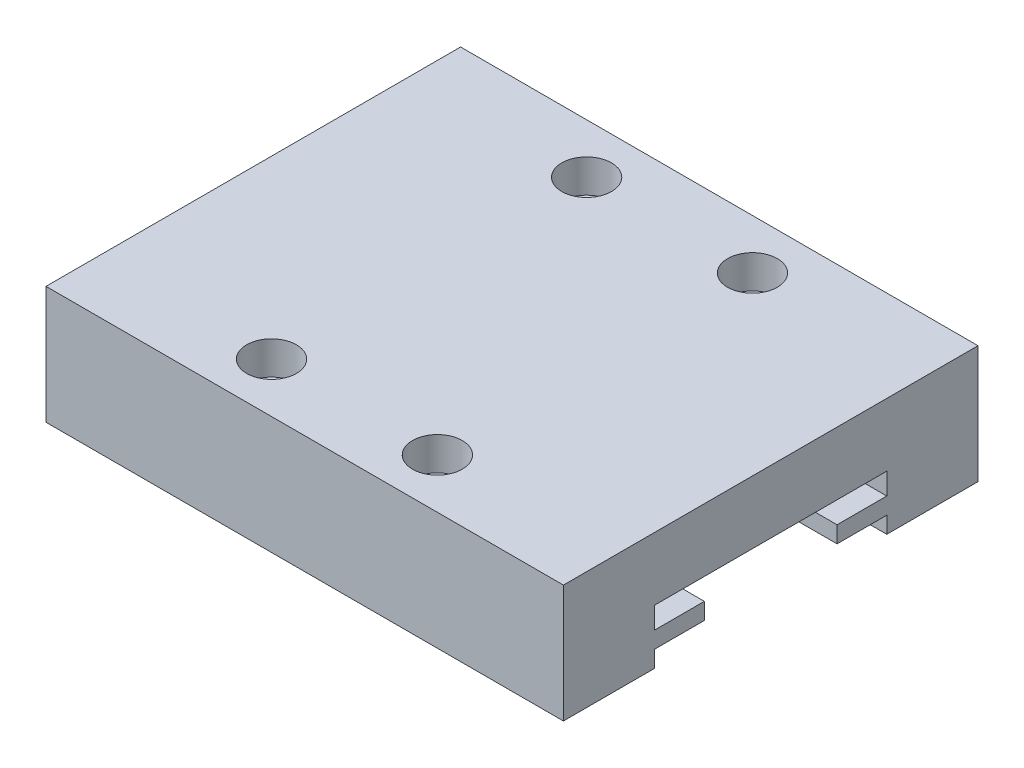
ISO-10303-21;
HEADER;
FILE_DESCRIPTION(('STEP AP214'),'2;1');
FILE_NAME('part.step','',(''),(''),'','','');
FILE_SCHEMA(('AUTOMOTIVE_DESIGN { 1 0 10303 214 1 1 1 1 }'));
ENDSEC;
DATA;
#1=APPLICATION_CONTEXT('core data for automotive mechanical design processes');
#2=APPLICATION_PROTOCOL_DEFINITION('international standard','automotive_design',2000,#1);
#3=PRODUCT_CONTEXT('',#1,'mechanical');
#4=PRODUCT('Part','Part','',(#3));
#5=PRODUCT_RELATED_PRODUCT_CATEGORY('part','',(#4));
#6=PRODUCT_DEFINITION_FORMATION('','',#4);
#7=PRODUCT_DEFINITION_CONTEXT('part definition',#1,'design');
#8=PRODUCT_DEFINITION('design','',#6,#7);
#9=PRODUCT_DEFINITION_SHAPE('','',#8);
#10=(LENGTH_UNIT() NAMED_UNIT(*) SI_UNIT(.MILLI.,.METRE.));
#11=(NAMED_UNIT(*) PLANE_ANGLE_UNIT() SI_UNIT($,.RADIAN.));
#12=(NAMED_UNIT(*) SI_UNIT($,.STERADIAN.) SOLID_ANGLE_UNIT());
#13=UNCERTAINTY_MEASURE_WITH_UNIT(LENGTH_MEASURE(1.E-05),#10,'distance_accuracy_value','');
#14=(GEOMETRIC_REPRESENTATION_CONTEXT(3) GLOBAL_UNCERTAINTY_ASSIGNED_CONTEXT((#13)) GLOBAL_UNIT_ASSIGNED_CONTEXT((#10,
#11,#12)) REPRESENTATION_CONTEXT('',''));
#15=CARTESIAN_POINT('',(0.,0.,0.));
#16=DIRECTION('',(0.,0.,1.));
#17=DIRECTION('',(1.,0.,0.));
#18=AXIS2_PLACEMENT_3D('',#15,#16,#17);
#19=CARTESIAN_POINT('',(0.,0.,0.));
#20=DIRECTION('',(0.,-1.,0.));
#21=DIRECTION('',(0.,0.,-1.));
#22=AXIS2_PLACEMENT_3D('',#19,#20,#21);
#23=PLANE('',#22);
#24=DIRECTION('',(1.,0.,0.));
#25=VECTOR('',#24,1.);
#26=CARTESIAN_POINT('',(0.,0.,-19.5));
#27=LINE('',#26,#25);
#28=CARTESIAN_POINT('',(0.,0.,-19.5));
#29=VERTEX_POINT('',#28);
#30=CARTESIAN_POINT('',(31.2,0.,-19.5));
#31=VERTEX_POINT('',#30);
#32=EDGE_CURVE('E165',#29,#31,#27,.T.);
#33=ORIENTED_EDGE('',*,*,#32,.F.);
#34=DIRECTION('',(0.,0.,1.));
#35=VECTOR('',#34,1.);
#36=CARTESIAN_POINT('',(0.,0.,0.));
#37=LINE('',#36,#35);
#38=CARTESIAN_POINT('',(0.,0.,-25.));
#39=VERTEX_POINT('',#38);
#40=EDGE_CURVE('E180',#39,#29,#37,.T.);
#41=ORIENTED_EDGE('',*,*,#40,.F.);
#42=DIRECTION('',(-1.,0.,0.));
#43=VECTOR('',#42,1.);
#44=CARTESIAN_POINT('',(0.,0.,-25.));
#45=LINE('',#44,#43);
#46=CARTESIAN_POINT('',(31.2,0.,-25.));
#47=VERTEX_POINT('',#46);
#48=EDGE_CURVE('E79',#47,#39,#45,.T.);
#49=ORIENTED_EDGE('',*,*,#48,.F.);
#50=DIRECTION('',(0.,0.,-1.));
#51=VECTOR('',#50,1.);
#52=CARTESIAN_POINT('',(31.2,0.,0.));
#53=LINE('',#52,#51);
#54=EDGE_CURVE('E189',#31,#47,#53,.T.);
#55=ORIENTED_EDGE('',*,*,#54,.F.);
#56=EDGE_LOOP('',(#33,#41,#49,#55));
#57=FACE_BOUND('',#56,.T.);
#58=ADVANCED_FACE('F34',(#57),#23,.T.);
#59=CARTESIAN_POINT('',(0.,7.1,0.));
#60=DIRECTION('',(1.,0.,0.));
#61=DIRECTION('',(0.,0.,-1.));
#62=AXIS2_PLACEMENT_3D('',#59,#60,#61);
#63=PLANE('',#62);
#64=ORIENTED_EDGE('',*,*,#40,.T.);
#65=DIRECTION('',(0.,-1.,0.));
#66=VECTOR('',#65,1.);
#67=CARTESIAN_POINT('',(0.,0.,-19.5));
#68=LINE('',#67,#66);
#69=CARTESIAN_POINT('',(0.,1.,-19.5));
#70=VERTEX_POINT('',#69);
#71=EDGE_CURVE('E259',#70,#29,#68,.T.);
#72=ORIENTED_EDGE('',*,*,#71,.F.);
#73=DIRECTION('',(0.,0.,-1.));
#74=VECTOR('',#73,1.);
#75=CARTESIAN_POINT('',(0.,1.,-19.5));
#76=LINE('',#75,#74);
#77=CARTESIAN_POINT('',(0.,1.,-16.5));
#78=VERTEX_POINT('',#77);
#79=EDGE_CURVE('E306',#78,#70,#76,.T.);
#80=ORIENTED_EDGE('',*,*,#79,.F.);
#81=DIRECTION('',(0.,-1.,0.));
#82=VECTOR('',#81,1.);
#83=CARTESIAN_POINT('',(0.,1.,-16.5));
#84=LINE('',#83,#82);
#85=CARTESIAN_POINT('',(0.,2.,-16.5));
#86=VERTEX_POINT('',#85);
#87=EDGE_CURVE('E304',#86,#78,#84,.T.);
#88=ORIENTED_EDGE('',*,*,#87,.F.);
#89=DIRECTION('',(0.,0.,1.));
#90=VECTOR('',#89,1.);
#91=CARTESIAN_POINT('',(0.,2.,-16.5));
#92=LINE('',#91,#90);
#93=CARTESIAN_POINT('',(0.,2.,-19.5));
#94=VERTEX_POINT('',#93);
#95=EDGE_CURVE('E238',#94,#86,#92,.T.);
#96=ORIENTED_EDGE('',*,*,#95,.F.);
#97=DIRECTION('',(0.,-1.,0.));
#98=VECTOR('',#97,1.);
#99=CARTESIAN_POINT('',(0.,2.,-19.5));
#100=LINE('',#99,#98);
#101=CARTESIAN_POINT('',(0.,3.3,-19.5));
#102=VERTEX_POINT('',#101);
#103=EDGE_CURVE('E301',#102,#94,#100,.T.);
#104=ORIENTED_EDGE('',*,*,#103,.F.);
#105=DIRECTION('',(0.,0.,-1.));
#106=VECTOR('',#105,1.);
#107=CARTESIAN_POINT('',(0.,3.3,-19.5));
#108=LINE('',#107,#106);
#109=CARTESIAN_POINT('',(0.,3.3,-5.50000000000001));
#110=VERTEX_POINT('',#109);
#111=EDGE_CURVE('E296',#110,#102,#108,.T.);
#112=ORIENTED_EDGE('',*,*,#111,.F.);
#113=DIRECTION('',(0.,1.,0.));
#114=VECTOR('',#113,1.);
#115=CARTESIAN_POINT('',(0.,2.,-5.5));
#116=LINE('',#115,#114);
#117=CARTESIAN_POINT('',(0.,2.,-5.5));
#118=VERTEX_POINT('',#117);
#119=EDGE_CURVE('E290',#118,#110,#116,.T.);
#120=ORIENTED_EDGE('',*,*,#119,.F.);
#121=DIRECTION('',(0.,0.,1.));
#122=VECTOR('',#121,1.);
#123=CARTESIAN_POINT('',(0.,2.,-8.5));
#124=LINE('',#123,#122);
#125=CARTESIAN_POINT('',(0.,2.,-8.5));
#126=VERTEX_POINT('',#125);
#127=EDGE_CURVE('E284',#126,#118,#124,.T.);
#128=ORIENTED_EDGE('',*,*,#127,.F.);
#129=DIRECTION('',(0.,1.,0.));
#130=VECTOR('',#129,1.);
#131=CARTESIAN_POINT('',(0.,1.,-8.5));
#132=LINE('',#131,#130);
#133=CARTESIAN_POINT('',(0.,1.,-8.5));
#134=VERTEX_POINT('',#133);
#135=EDGE_CURVE('E278',#134,#126,#132,.T.);
#136=ORIENTED_EDGE('',*,*,#135,.F.);
#137=DIRECTION('',(0.,0.,-1.));
#138=VECTOR('',#137,1.);
#139=CARTESIAN_POINT('',(0.,1.,-5.5));
#140=LINE('',#139,#138);
#141=CARTESIAN_POINT('',(0.,1.,-5.5));
#142=VERTEX_POINT('',#141);
#143=EDGE_CURVE('E175',#142,#134,#140,.T.);
#144=ORIENTED_EDGE('',*,*,#143,.F.);
#145=DIRECTION('',(0.,1.,0.));
#146=VECTOR('',#145,1.);
#147=CARTESIAN_POINT('',(0.,0.,-5.5));
#148=LINE('',#147,#146);
#149=CARTESIAN_POINT('',(0.,0.,-5.5));
#150=VERTEX_POINT('',#149);
#151=EDGE_CURVE('E159',#150,#142,#148,.T.);
#152=ORIENTED_EDGE('',*,*,#151,.F.);
#153=CARTESIAN_POINT('',(0.,0.,0.));
#154=VERTEX_POINT('',#153);
#155=EDGE_CURVE('E171',#150,#154,#37,.T.);
#156=ORIENTED_EDGE('',*,*,#155,.T.);
#157=DIRECTION('',(0.,-1.,0.));
#158=VECTOR('',#157,1.);
#159=CARTESIAN_POINT('',(0.,7.1,0.));
#160=LINE('',#159,#158);
#161=CARTESIAN_POINT('',(0.,7.1,0.));
#162=VERTEX_POINT('',#161);
#163=EDGE_CURVE('E166',#162,#154,#160,.T.);
#164=ORIENTED_EDGE('',*,*,#163,.F.);
#165=DIRECTION('',(0.,0.,1.));
#166=VECTOR('',#165,1.);
#167=CARTESIAN_POINT('',(0.,7.1,0.));
#168=LINE('',#167,#166);
#169=CARTESIAN_POINT('',(0.,7.1,-25.));
#170=VERTEX_POINT('',#169);
#171=EDGE_CURVE('E193',#170,#162,#168,.T.);
#172=ORIENTED_EDGE('',*,*,#171,.F.);
#173=DIRECTION('',(0.,-1.,0.));
#174=VECTOR('',#173,1.);
#175=CARTESIAN_POINT('',(0.,7.1,-25.));
#176=LINE('',#175,#174);
#177=EDGE_CURVE('E194',#170,#39,#176,.T.);
#178=ORIENTED_EDGE('',*,*,#177,.T.);
#179=EDGE_LOOP('',(#64,#72,#80,#88,#96,#104,#112,#120,#128,#136,#144,#152,#156,#164,#172,#178));
#180=FACE_BOUND('',#179,.T.);
#181=ADVANCED_FACE('F36',(#180),#63,.F.);
#182=CARTESIAN_POINT('',(0.,7.1,0.));
#183=DIRECTION('',(0.,0.,-1.));
#184=DIRECTION('',(-1.,0.,0.));
#185=AXIS2_PLACEMENT_3D('',#182,#183,#184);
#186=PLANE('',#185);
#187=DIRECTION('',(1.,0.,0.));
#188=VECTOR('',#187,1.);
#189=CARTESIAN_POINT('',(0.,0.,0.));
#190=LINE('',#189,#188);
#191=CARTESIAN_POINT('',(31.2,0.,0.));
#192=VERTEX_POINT('',#191);
#193=EDGE_CURVE('E179',#154,#192,#190,.T.);
#194=ORIENTED_EDGE('',*,*,#193,.T.);
#195=DIRECTION('',(0.,-1.,0.));
#196=VECTOR('',#195,1.);
#197=CARTESIAN_POINT('',(31.2,7.1,0.));
#198=LINE('',#197,#196);
#199=CARTESIAN_POINT('',(31.2,7.1,0.));
#200=VERTEX_POINT('',#199);
#201=EDGE_CURVE('E198',#200,#192,#198,.T.);
#202=ORIENTED_EDGE('',*,*,#201,.F.);
#203=DIRECTION('',(1.,0.,0.));
#204=VECTOR('',#203,1.);
#205=CARTESIAN_POINT('',(0.,7.1,0.));
#206=LINE('',#205,#204);
#207=EDGE_CURVE('E87',#162,#200,#206,.T.);
#208=ORIENTED_EDGE('',*,*,#207,.F.);
#209=ORIENTED_EDGE('',*,*,#163,.T.);
#210=EDGE_LOOP('',(#194,#202,#208,#209));
#211=FACE_BOUND('',#210,.T.);
#212=ADVANCED_FACE('F270',(#211),#186,.F.);
#213=CARTESIAN_POINT('',(31.2,7.1,0.));
#214=DIRECTION('',(-1.,0.,0.));
#215=DIRECTION('',(0.,0.,1.));
#216=AXIS2_PLACEMENT_3D('',#213,#214,#215);
#217=PLANE('',#216);
#218=DIRECTION('',(0.,0.,-1.));
#219=VECTOR('',#218,1.);
#220=CARTESIAN_POINT('',(31.2,1.,0.));
#221=LINE('',#220,#219);
#222=CARTESIAN_POINT('',(31.2,1.,-16.5));
#223=VERTEX_POINT('',#222);
#224=CARTESIAN_POINT('',(31.2,1.,-19.5));
#225=VERTEX_POINT('',#224);
#226=EDGE_CURVE('E11',#223,#225,#221,.T.);
#227=ORIENTED_EDGE('',*,*,#226,.T.);
#228=DIRECTION('',(0.,-1.,0.));
#229=VECTOR('',#228,1.);
#230=CARTESIAN_POINT('',(31.2,7.1,-19.5));
#231=LINE('',#230,#229);
#232=EDGE_CURVE('E181',#225,#31,#231,.T.);
#233=ORIENTED_EDGE('',*,*,#232,.T.);
#234=ORIENTED_EDGE('',*,*,#54,.T.);
#235=DIRECTION('',(0.,-1.,0.));
#236=VECTOR('',#235,1.);
#237=CARTESIAN_POINT('',(31.2,7.1,-25.));
#238=LINE('',#237,#236);
#239=CARTESIAN_POINT('',(31.2,7.1,-25.));
#240=VERTEX_POINT('',#239);
#241=EDGE_CURVE('E196',#240,#47,#238,.T.);
#242=ORIENTED_EDGE('',*,*,#241,.F.);
#243=DIRECTION('',(0.,0.,-1.));
#244=VECTOR('',#243,1.);
#245=CARTESIAN_POINT('',(31.2,7.1,0.));
#246=LINE('',#245,#244);
#247=EDGE_CURVE('E262',#200,#240,#246,.T.);
#248=ORIENTED_EDGE('',*,*,#247,.F.);
#249=ORIENTED_EDGE('',*,*,#201,.T.);
#250=CARTESIAN_POINT('',(31.2,0.,-5.5));
#251=VERTEX_POINT('',#250);
#252=EDGE_CURVE('E190',#192,#251,#53,.T.);
#253=ORIENTED_EDGE('',*,*,#252,.T.);
#254=DIRECTION('',(0.,1.,0.));
#255=VECTOR('',#254,1.);
#256=CARTESIAN_POINT('',(31.2,7.1,-5.5));
#257=LINE('',#256,#255);
#258=CARTESIAN_POINT('',(31.2,1.,-5.5));
#259=VERTEX_POINT('',#258);
#260=EDGE_CURVE('E49',#251,#259,#257,.T.);
#261=ORIENTED_EDGE('',*,*,#260,.T.);
#262=DIRECTION('',(0.,0.,-1.));
#263=VECTOR('',#262,1.);
#264=CARTESIAN_POINT('',(31.2,1.,0.));
#265=LINE('',#264,#263);
#266=CARTESIAN_POINT('',(31.2,1.,-8.5));
#267=VERTEX_POINT('',#266);
#268=EDGE_CURVE('E203',#259,#267,#265,.T.);
#269=ORIENTED_EDGE('',*,*,#268,.T.);
#270=DIRECTION('',(0.,1.,0.));
#271=VECTOR('',#270,1.);
#272=CARTESIAN_POINT('',(31.2,7.1,-8.5));
#273=LINE('',#272,#271);
#274=CARTESIAN_POINT('',(31.2,2.,-8.5));
#275=VERTEX_POINT('',#274);
#276=EDGE_CURVE('E206',#267,#275,#273,.T.);
#277=ORIENTED_EDGE('',*,*,#276,.T.);
#278=DIRECTION('',(0.,0.,1.));
#279=VECTOR('',#278,1.);
#280=CARTESIAN_POINT('',(31.2,2.,0.));
#281=LINE('',#280,#279);
#282=CARTESIAN_POINT('',(31.2,2.,-5.5));
#283=VERTEX_POINT('',#282);
#284=EDGE_CURVE('E209',#275,#283,#281,.T.);
#285=ORIENTED_EDGE('',*,*,#284,.T.);
#286=DIRECTION('',(0.,1.,0.));
#287=VECTOR('',#286,1.);
#288=CARTESIAN_POINT('',(31.2,7.09999999999998,-5.50000000000002));
#289=LINE('',#288,#287);
#290=CARTESIAN_POINT('',(31.2,3.3,-5.50000000000001));
#291=VERTEX_POINT('',#290);
#292=EDGE_CURVE('E212',#283,#291,#289,.T.);
#293=ORIENTED_EDGE('',*,*,#292,.T.);
#294=DIRECTION('',(0.,0.,-1.));
#295=VECTOR('',#294,1.);
#296=CARTESIAN_POINT('',(31.2,3.3,0.));
#297=LINE('',#296,#295);
#298=CARTESIAN_POINT('',(31.2,3.3,-19.5));
#299=VERTEX_POINT('',#298);
#300=EDGE_CURVE('E215',#291,#299,#297,.T.);
#301=ORIENTED_EDGE('',*,*,#300,.T.);
#302=DIRECTION('',(0.,-1.,0.));
#303=VECTOR('',#302,1.);
#304=CARTESIAN_POINT('',(31.2,7.10000000000005,-19.5));
#305=LINE('',#304,#303);
#306=CARTESIAN_POINT('',(31.2,2.,-19.5));
#307=VERTEX_POINT('',#306);
#308=EDGE_CURVE('E218',#299,#307,#305,.T.);
#309=ORIENTED_EDGE('',*,*,#308,.T.);
#310=DIRECTION('',(0.,0.,1.));
#311=VECTOR('',#310,1.);
#312=CARTESIAN_POINT('',(31.2,2.,0.));
#313=LINE('',#312,#311);
#314=CARTESIAN_POINT('',(31.2,2.,-16.5));
#315=VERTEX_POINT('',#314);
#316=EDGE_CURVE('E221',#307,#315,#313,.T.);
#317=ORIENTED_EDGE('',*,*,#316,.T.);
#318=DIRECTION('',(0.,-1.,0.));
#319=VECTOR('',#318,1.);
#320=CARTESIAN_POINT('',(31.2,7.1,-16.5));
#321=LINE('',#320,#319);
#322=EDGE_CURVE('E42',#315,#223,#321,.T.);
#323=ORIENTED_EDGE('',*,*,#322,.T.);
#324=EDGE_LOOP('',(#227,#233,#234,#242,#248,#249,#253,#261,#269,#277,#285,#293,#301,#309,#317,#323));
#325=FACE_BOUND('',#324,.T.);
#326=ADVANCED_FACE('F225',(#325),#217,.F.);
#327=CARTESIAN_POINT('',(0.,7.1,-25.));
#328=DIRECTION('',(0.,0.,1.));
#329=DIRECTION('',(1.,0.,0.));
#330=AXIS2_PLACEMENT_3D('',#327,#328,#329);
#331=PLANE('',#330);
#332=ORIENTED_EDGE('',*,*,#48,.T.);
#333=ORIENTED_EDGE('',*,*,#177,.F.);
#334=DIRECTION('',(-1.,0.,0.));
#335=VECTOR('',#334,1.);
#336=CARTESIAN_POINT('',(0.,7.1,-25.));
#337=LINE('',#336,#335);
#338=EDGE_CURVE('E58',#240,#170,#337,.T.);
#339=ORIENTED_EDGE('',*,*,#338,.F.);
#340=ORIENTED_EDGE('',*,*,#241,.T.);
#341=EDGE_LOOP('',(#332,#333,#339,#340));
#342=FACE_BOUND('',#341,.T.);
#343=ADVANCED_FACE('F267',(#342),#331,.F.);
#344=CARTESIAN_POINT('',(0.,7.1,0.));
#345=DIRECTION('',(0.,-1.,0.));
#346=DIRECTION('',(0.,0.,-1.));
#347=AXIS2_PLACEMENT_3D('',#344,#345,#346);
#348=PLANE('',#347);
#349=CARTESIAN_POINT('',(10.6,7.1,-3.));
#350=DIRECTION('',(0.,1.,0.));
#351=DIRECTION('',(0.,0.,-1.));
#352=AXIS2_PLACEMENT_3D('',#349,#350,#351);
#353=CIRCLE('',#352,1.5);
#354=CARTESIAN_POINT('',(10.6,7.1,-4.5));
#355=VERTEX_POINT('',#354);
#356=EDGE_CURVE('E413',#355,#355,#353,.T.);
#357=ORIENTED_EDGE('',*,*,#356,.F.);
#358=EDGE_LOOP('',(#357));
#359=FACE_BOUND('',#358,.T.);
#360=CARTESIAN_POINT('',(20.6,7.1,-3.));
#361=DIRECTION('',(0.,1.,0.));
#362=DIRECTION('',(0.,0.,1.));
#363=AXIS2_PLACEMENT_3D('',#360,#361,#362);
#364=CIRCLE('',#363,1.5);
#365=CARTESIAN_POINT('',(20.6,7.1,-1.5));
#366=VERTEX_POINT('',#365);
#367=EDGE_CURVE('E407',#366,#366,#364,.T.);
#368=ORIENTED_EDGE('',*,*,#367,.F.);
#369=EDGE_LOOP('',(#368));
#370=FACE_BOUND('',#369,.T.);
#371=CARTESIAN_POINT('',(20.6,7.1,-22.));
#372=DIRECTION('',(0.,1.,0.));
#373=DIRECTION('',(0.,0.,-1.));
#374=AXIS2_PLACEMENT_3D('',#371,#372,#373);
#375=CIRCLE('',#374,1.5);
#376=CARTESIAN_POINT('',(20.6,7.1,-23.5));
#377=VERTEX_POINT('',#376);
#378=EDGE_CURVE('E397',#377,#377,#375,.T.);
#379=ORIENTED_EDGE('',*,*,#378,.F.);
#380=EDGE_LOOP('',(#379));
#381=FACE_BOUND('',#380,.T.);
#382=CARTESIAN_POINT('',(10.6,7.1,-22.));
#383=DIRECTION('',(0.,1.,0.));
#384=DIRECTION('',(0.,0.,1.));
#385=AXIS2_PLACEMENT_3D('',#382,#383,#384);
#386=CIRCLE('',#385,1.5);
#387=CARTESIAN_POINT('',(10.6,7.1,-20.5));
#388=VERTEX_POINT('',#387);
#389=EDGE_CURVE('E396',#388,#388,#386,.T.);
#390=ORIENTED_EDGE('',*,*,#389,.F.);
#391=EDGE_LOOP('',(#390));
#392=FACE_BOUND('',#391,.T.);
#393=ORIENTED_EDGE('',*,*,#171,.T.);
#394=ORIENTED_EDGE('',*,*,#207,.T.);
#395=ORIENTED_EDGE('',*,*,#247,.T.);
#396=ORIENTED_EDGE('',*,*,#338,.T.);
#397=EDGE_LOOP('',(#393,#394,#395,#396));
#398=FACE_BOUND('',#397,.T.);
#399=ADVANCED_FACE('F265',(#359,#370,#381,#392,#398),#348,.F.);
#400=DIRECTION('',(-1.,0.,0.));
#401=VECTOR('',#400,1.);
#402=CARTESIAN_POINT('',(0.,0.,-5.5));
#403=LINE('',#402,#401);
#404=EDGE_CURVE('E156',#251,#150,#403,.T.);
#405=ORIENTED_EDGE('',*,*,#404,.F.);
#406=ORIENTED_EDGE('',*,*,#252,.F.);
#407=ORIENTED_EDGE('',*,*,#193,.F.);
#408=ORIENTED_EDGE('',*,*,#155,.F.);
#409=EDGE_LOOP('',(#405,#406,#407,#408));
#410=FACE_BOUND('',#409,.T.);
#411=ADVANCED_FACE('F178',(#410),#23,.T.);
#412=CARTESIAN_POINT('',(50.9,1.,-19.5));
#413=DIRECTION('',(0.,1.,0.));
#414=DIRECTION('',(0.,0.,1.));
#415=AXIS2_PLACEMENT_3D('',#412,#413,#414);
#416=PLANE('',#415);
#417=DIRECTION('',(-1.,0.,0.));
#418=VECTOR('',#417,1.);
#419=CARTESIAN_POINT('',(50.9,1.,-16.5));
#420=LINE('',#419,#418);
#421=EDGE_CURVE('E233',#223,#78,#420,.T.);
#422=ORIENTED_EDGE('',*,*,#421,.T.);
#423=ORIENTED_EDGE('',*,*,#79,.T.);
#424=DIRECTION('',(-1.,0.,0.));
#425=VECTOR('',#424,1.);
#426=CARTESIAN_POINT('',(50.9,1.,-19.5));
#427=LINE('',#426,#425);
#428=EDGE_CURVE('E242',#225,#70,#427,.T.);
#429=ORIENTED_EDGE('',*,*,#428,.F.);
#430=ORIENTED_EDGE('',*,*,#226,.F.);
#431=EDGE_LOOP('',(#422,#423,#429,#430));
#432=FACE_BOUND('',#431,.T.);
#433=ADVANCED_FACE('F318',(#432),#416,.F.);
#434=CARTESIAN_POINT('',(50.9,1.,-16.5));
#435=DIRECTION('',(0.,0.,-1.));
#436=DIRECTION('',(-1.,0.,0.));
#437=AXIS2_PLACEMENT_3D('',#434,#435,#436);
#438=PLANE('',#437);
#439=DIRECTION('',(-1.,0.,0.));
#440=VECTOR('',#439,1.);
#441=CARTESIAN_POINT('',(50.9,2.,-16.5));
#442=LINE('',#441,#440);
#443=EDGE_CURVE('E231',#315,#86,#442,.T.);
#444=ORIENTED_EDGE('',*,*,#443,.T.);
#445=ORIENTED_EDGE('',*,*,#87,.T.);
#446=ORIENTED_EDGE('',*,*,#421,.F.);
#447=ORIENTED_EDGE('',*,*,#322,.F.);
#448=EDGE_LOOP('',(#444,#445,#446,#447));
#449=FACE_BOUND('',#448,.T.);
#450=ADVANCED_FACE('F229',(#449),#438,.F.);
#451=CARTESIAN_POINT('',(50.9,2.,-16.5));
#452=DIRECTION('',(0.,-1.,0.));
#453=DIRECTION('',(0.,0.,-1.));
#454=AXIS2_PLACEMENT_3D('',#451,#452,#453);
#455=PLANE('',#454);
#456=DIRECTION('',(-1.,0.,0.));
#457=VECTOR('',#456,1.);
#458=CARTESIAN_POINT('',(50.9,2.,-19.5));
#459=LINE('',#458,#457);
#460=EDGE_CURVE('E240',#307,#94,#459,.T.);
#461=ORIENTED_EDGE('',*,*,#460,.T.);
#462=ORIENTED_EDGE('',*,*,#95,.T.);
#463=ORIENTED_EDGE('',*,*,#443,.F.);
#464=ORIENTED_EDGE('',*,*,#316,.F.);
#465=EDGE_LOOP('',(#461,#462,#463,#464));
#466=FACE_BOUND('',#465,.T.);
#467=ADVANCED_FACE('F235',(#466),#455,.F.);
#468=CARTESIAN_POINT('',(50.9,2.,-19.5));
#469=DIRECTION('',(0.,0.,-1.));
#470=DIRECTION('',(0.,1.,0.));
#471=AXIS2_PLACEMENT_3D('',#468,#469,#470);
#472=PLANE('',#471);
#473=DIRECTION('',(-1.,0.,0.));
#474=VECTOR('',#473,1.);
#475=CARTESIAN_POINT('',(50.9,3.3,-19.5));
#476=LINE('',#475,#474);
#477=EDGE_CURVE('E244',#299,#102,#476,.T.);
#478=ORIENTED_EDGE('',*,*,#477,.T.);
#479=ORIENTED_EDGE('',*,*,#103,.T.);
#480=ORIENTED_EDGE('',*,*,#460,.F.);
#481=ORIENTED_EDGE('',*,*,#308,.F.);
#482=EDGE_LOOP('',(#478,#479,#480,#481));
#483=FACE_BOUND('',#482,.T.);
#484=ADVANCED_FACE('F300',(#483),#472,.F.);
#485=CARTESIAN_POINT('',(50.9,3.3,-19.5));
#486=DIRECTION('',(0.,1.,0.));
#487=DIRECTION('',(0.,0.,1.));
#488=AXIS2_PLACEMENT_3D('',#485,#486,#487);
#489=PLANE('',#488);
#490=DIRECTION('',(-1.,0.,0.));
#491=VECTOR('',#490,1.);
#492=CARTESIAN_POINT('',(50.9,3.3,-5.50000000000001));
#493=LINE('',#492,#491);
#494=EDGE_CURVE('E249',#291,#110,#493,.T.);
#495=ORIENTED_EDGE('',*,*,#494,.T.);
#496=ORIENTED_EDGE('',*,*,#111,.T.);
#497=ORIENTED_EDGE('',*,*,#477,.F.);
#498=ORIENTED_EDGE('',*,*,#300,.F.);
#499=EDGE_LOOP('',(#495,#496,#497,#498));
#500=FACE_BOUND('',#499,.T.);
#501=ADVANCED_FACE('F294',(#500),#489,.F.);
#502=CARTESIAN_POINT('',(50.9,2.,-5.5));
#503=DIRECTION('',(0.,0.,1.));
#504=DIRECTION('',(0.,-1.,0.));
#505=AXIS2_PLACEMENT_3D('',#502,#503,#504);
#506=PLANE('',#505);
#507=DIRECTION('',(-1.,0.,0.));
#508=VECTOR('',#507,1.);
#509=CARTESIAN_POINT('',(50.9,2.,-5.5));
#510=LINE('',#509,#508);
#511=EDGE_CURVE('E251',#283,#118,#510,.T.);
#512=ORIENTED_EDGE('',*,*,#511,.T.);
#513=ORIENTED_EDGE('',*,*,#119,.T.);
#514=ORIENTED_EDGE('',*,*,#494,.F.);
#515=ORIENTED_EDGE('',*,*,#292,.F.);
#516=EDGE_LOOP('',(#512,#513,#514,#515));
#517=FACE_BOUND('',#516,.T.);
#518=ADVANCED_FACE('F288',(#517),#506,.F.);
#519=CARTESIAN_POINT('',(50.9,2.,-8.5));
#520=DIRECTION('',(0.,-1.,0.));
#521=DIRECTION('',(0.,0.,-1.));
#522=AXIS2_PLACEMENT_3D('',#519,#520,#521);
#523=PLANE('',#522);
#524=DIRECTION('',(-1.,0.,0.));
#525=VECTOR('',#524,1.);
#526=CARTESIAN_POINT('',(50.9,2.,-8.5));
#527=LINE('',#526,#525);
#528=EDGE_CURVE('E253',#275,#126,#527,.T.);
#529=ORIENTED_EDGE('',*,*,#528,.T.);
#530=ORIENTED_EDGE('',*,*,#127,.T.);
#531=ORIENTED_EDGE('',*,*,#511,.F.);
#532=ORIENTED_EDGE('',*,*,#284,.F.);
#533=EDGE_LOOP('',(#529,#530,#531,#532));
#534=FACE_BOUND('',#533,.T.);
#535=ADVANCED_FACE('F282',(#534),#523,.F.);
#536=CARTESIAN_POINT('',(50.9,1.,-8.5));
#537=DIRECTION('',(0.,0.,1.));
#538=DIRECTION('',(1.,0.,0.));
#539=AXIS2_PLACEMENT_3D('',#536,#537,#538);
#540=PLANE('',#539);
#541=DIRECTION('',(-1.,0.,0.));
#542=VECTOR('',#541,1.);
#543=CARTESIAN_POINT('',(50.9,1.,-8.5));
#544=LINE('',#543,#542);
#545=EDGE_CURVE('E255',#267,#134,#544,.T.);
#546=ORIENTED_EDGE('',*,*,#545,.T.);
#547=ORIENTED_EDGE('',*,*,#135,.T.);
#548=ORIENTED_EDGE('',*,*,#528,.F.);
#549=ORIENTED_EDGE('',*,*,#276,.F.);
#550=EDGE_LOOP('',(#546,#547,#548,#549));
#551=FACE_BOUND('',#550,.T.);
#552=ADVANCED_FACE('F276',(#551),#540,.F.);
#553=CARTESIAN_POINT('',(50.9,1.,-5.5));
#554=DIRECTION('',(0.,1.,0.));
#555=DIRECTION('',(0.,0.,1.));
#556=AXIS2_PLACEMENT_3D('',#553,#554,#555);
#557=PLANE('',#556);
#558=DIRECTION('',(-1.,0.,0.));
#559=VECTOR('',#558,1.);
#560=CARTESIAN_POINT('',(50.9,1.,-5.5));
#561=LINE('',#560,#559);
#562=EDGE_CURVE('E257',#259,#142,#561,.T.);
#563=ORIENTED_EDGE('',*,*,#562,.T.);
#564=ORIENTED_EDGE('',*,*,#143,.T.);
#565=ORIENTED_EDGE('',*,*,#545,.F.);
#566=ORIENTED_EDGE('',*,*,#268,.F.);
#567=EDGE_LOOP('',(#563,#564,#565,#566));
#568=FACE_BOUND('',#567,.T.);
#569=ADVANCED_FACE('F273',(#568),#557,.F.);
#570=CARTESIAN_POINT('',(50.9,0.,-19.5));
#571=DIRECTION('',(0.,0.,-1.));
#572=DIRECTION('',(-1.,0.,0.));
#573=AXIS2_PLACEMENT_3D('',#570,#571,#572);
#574=PLANE('',#573);
#575=ORIENTED_EDGE('',*,*,#428,.T.);
#576=ORIENTED_EDGE('',*,*,#71,.T.);
#577=ORIENTED_EDGE('',*,*,#32,.T.);
#578=ORIENTED_EDGE('',*,*,#232,.F.);
#579=EDGE_LOOP('',(#575,#576,#577,#578));
#580=FACE_BOUND('',#579,.T.);
#581=ADVANCED_FACE('F314',(#580),#574,.F.);
#582=CARTESIAN_POINT('',(50.9,0.,-5.5));
#583=DIRECTION('',(0.,0.,1.));
#584=DIRECTION('',(1.,0.,0.));
#585=AXIS2_PLACEMENT_3D('',#582,#583,#584);
#586=PLANE('',#585);
#587=ORIENTED_EDGE('',*,*,#404,.T.);
#588=ORIENTED_EDGE('',*,*,#151,.T.);
#589=ORIENTED_EDGE('',*,*,#562,.F.);
#590=ORIENTED_EDGE('',*,*,#260,.F.);
#591=EDGE_LOOP('',(#587,#588,#589,#590));
#592=FACE_BOUND('',#591,.T.);
#593=ADVANCED_FACE('F158',(#592),#586,.F.);
#594=CARTESIAN_POINT('',(10.6,5.1,-22.));
#595=DIRECTION('',(0.,1.,0.));
#596=DIRECTION('',(0.,0.,1.));
#597=AXIS2_PLACEMENT_3D('',#594,#595,#596);
#598=CYLINDRICAL_SURFACE('',#597,1.5);
#599=CARTESIAN_POINT('',(10.6,5.1,-22.));
#600=DIRECTION('',(0.,1.,0.));
#601=DIRECTION('',(0.,0.,1.));
#602=AXIS2_PLACEMENT_3D('',#599,#600,#601);
#603=CIRCLE('',#602,1.5);
#604=CARTESIAN_POINT('',(10.6,5.1,-20.5));
#605=VERTEX_POINT('',#604);
#606=EDGE_CURVE('E176',#605,#605,#603,.T.);
#607=ORIENTED_EDGE('',*,*,#606,.F.);
#608=EDGE_LOOP('',(#607));
#609=FACE_BOUND('',#608,.T.);
#610=ORIENTED_EDGE('',*,*,#389,.T.);
#611=EDGE_LOOP('',(#610));
#612=FACE_BOUND('',#611,.T.);
#613=ADVANCED_FACE('F342',(#609,#612),#598,.F.);
#614=CARTESIAN_POINT('',(10.6,5.1,-22.));
#615=DIRECTION('',(0.,1.,0.));
#616=DIRECTION('',(0.,0.,1.));
#617=AXIS2_PLACEMENT_3D('',#614,#615,#616);
#618=PLANE('',#617);
#619=ORIENTED_EDGE('',*,*,#606,.T.);
#620=EDGE_LOOP('',(#619));
#621=FACE_BOUND('',#620,.T.);
#622=ADVANCED_FACE('F363',(#621),#618,.T.);
#623=CARTESIAN_POINT('',(20.6,5.1,-22.));
#624=DIRECTION('',(0.,1.,0.));
#625=DIRECTION('',(0.,0.,1.));
#626=AXIS2_PLACEMENT_3D('',#623,#624,#625);
#627=CYLINDRICAL_SURFACE('',#626,1.5);
#628=CARTESIAN_POINT('',(20.6,5.1,-22.));
#629=DIRECTION('',(0.,1.,0.));
#630=DIRECTION('',(0.,0.,-1.));
#631=AXIS2_PLACEMENT_3D('',#628,#629,#630);
#632=CIRCLE('',#631,1.5);
#633=CARTESIAN_POINT('',(20.6,5.1,-23.5));
#634=VERTEX_POINT('',#633);
#635=EDGE_CURVE('E395',#634,#634,#632,.T.);
#636=ORIENTED_EDGE('',*,*,#635,.F.);
#637=EDGE_LOOP('',(#636));
#638=FACE_BOUND('',#637,.T.);
#639=ORIENTED_EDGE('',*,*,#378,.T.);
#640=EDGE_LOOP('',(#639));
#641=FACE_BOUND('',#640,.T.);
#642=ADVANCED_FACE('F367',(#638,#641),#627,.F.);
#643=CARTESIAN_POINT('',(20.6,5.1,-22.));
#644=DIRECTION('',(0.,-1.,0.));
#645=DIRECTION('',(0.,0.,-1.));
#646=AXIS2_PLACEMENT_3D('',#643,#644,#645);
#647=PLANE('',#646);
#648=ORIENTED_EDGE('',*,*,#635,.T.);
#649=EDGE_LOOP('',(#648));
#650=FACE_BOUND('',#649,.T.);
#651=ADVANCED_FACE('F381',(#650),#647,.F.);
#652=CARTESIAN_POINT('',(20.6,5.1,-3.));
#653=DIRECTION('',(0.,1.,0.));
#654=DIRECTION('',(0.,0.,1.));
#655=AXIS2_PLACEMENT_3D('',#652,#653,#654);
#656=CYLINDRICAL_SURFACE('',#655,1.5);
#657=CARTESIAN_POINT('',(20.6,5.1,-3.));
#658=DIRECTION('',(0.,1.,0.));
#659=DIRECTION('',(0.,0.,1.));
#660=AXIS2_PLACEMENT_3D('',#657,#658,#659);
#661=CIRCLE('',#660,1.5);
#662=CARTESIAN_POINT('',(20.6,5.1,-1.5));
#663=VERTEX_POINT('',#662);
#664=EDGE_CURVE('E402',#663,#663,#661,.T.);
#665=ORIENTED_EDGE('',*,*,#664,.F.);
#666=EDGE_LOOP('',(#665));
#667=FACE_BOUND('',#666,.T.);
#668=ORIENTED_EDGE('',*,*,#367,.T.);
#669=EDGE_LOOP('',(#668));
#670=FACE_BOUND('',#669,.T.);
#671=ADVANCED_FACE('F378',(#667,#670),#656,.F.);
#672=CARTESIAN_POINT('',(20.6,5.1,-3.));
#673=DIRECTION('',(0.,1.,0.));
#674=DIRECTION('',(0.,0.,1.));
#675=AXIS2_PLACEMENT_3D('',#672,#673,#674);
#676=PLANE('',#675);
#677=ORIENTED_EDGE('',*,*,#664,.T.);
#678=EDGE_LOOP('',(#677));
#679=FACE_BOUND('',#678,.T.);
#680=ADVANCED_FACE('F373',(#679),#676,.T.);
#681=CARTESIAN_POINT('',(10.6,5.1,-3.));
#682=DIRECTION('',(0.,1.,0.));
#683=DIRECTION('',(0.,0.,1.));
#684=AXIS2_PLACEMENT_3D('',#681,#682,#683);
#685=CYLINDRICAL_SURFACE('',#684,1.5);
#686=CARTESIAN_POINT('',(10.6,5.1,-3.));
#687=DIRECTION('',(0.,1.,0.));
#688=DIRECTION('',(0.,0.,-1.));
#689=AXIS2_PLACEMENT_3D('',#686,#687,#688);
#690=CIRCLE('',#689,1.5);
#691=CARTESIAN_POINT('',(10.6,5.1,-4.5));
#692=VERTEX_POINT('',#691);
#693=EDGE_CURVE('E410',#692,#692,#690,.T.);
#694=ORIENTED_EDGE('',*,*,#693,.F.);
#695=EDGE_LOOP('',(#694));
#696=FACE_BOUND('',#695,.T.);
#697=ORIENTED_EDGE('',*,*,#356,.T.);
#698=EDGE_LOOP('',(#697));
#699=FACE_BOUND('',#698,.T.);
#700=ADVANCED_FACE('F369',(#696,#699),#685,.F.);
#701=CARTESIAN_POINT('',(10.6,5.1,-3.));
#702=DIRECTION('',(0.,-1.,0.));
#703=DIRECTION('',(0.,0.,-1.));
#704=AXIS2_PLACEMENT_3D('',#701,#702,#703);
#705=PLANE('',#704);
#706=ORIENTED_EDGE('',*,*,#693,.T.);
#707=EDGE_LOOP('',(#706));
#708=FACE_BOUND('',#707,.T.);
#709=ADVANCED_FACE('F372',(#708),#705,.F.);
#710=CLOSED_SHELL('',(#58,#181,#212,#326,#343,#399,#411,#433,#450,#467,#484,#501,#518,#535,#552,
#569,#581,#593,#613,#622,#642,#651,#671,#680,#700,#709));
#711=MANIFOLD_SOLID_BREP('B2',#710);
#712=ADVANCED_BREP_SHAPE_REPRESENTATION('',(#18,#711),#14);
#713=SHAPE_DEFINITION_REPRESENTATION(#9,#712);
ENDSEC;
END-ISO-10303-21;
